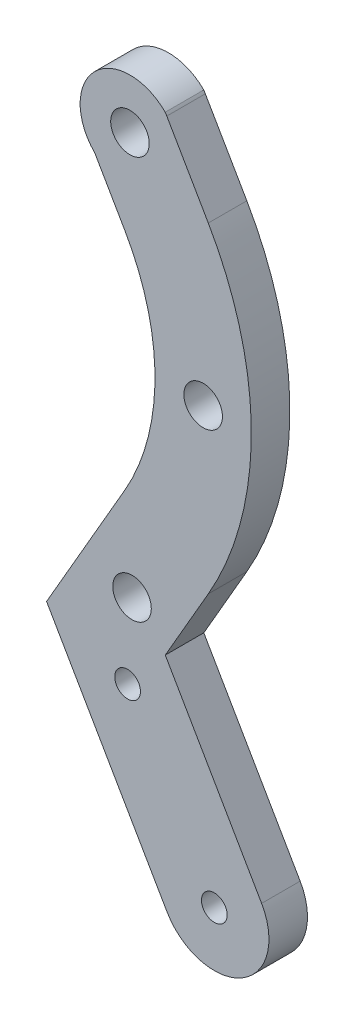
ISO-10303-21;
HEADER;
FILE_DESCRIPTION(('STEP AP214'),'2;1');
FILE_NAME('part.step','',(''),(''),'','','');
FILE_SCHEMA(('AUTOMOTIVE_DESIGN { 1 0 10303 214 1 1 1 1 }'));
ENDSEC;
DATA;
#1=APPLICATION_CONTEXT('core data for automotive mechanical design processes');
#2=APPLICATION_PROTOCOL_DEFINITION('international standard','automotive_design',2000,#1);
#3=PRODUCT_CONTEXT('',#1,'mechanical');
#4=PRODUCT('Part','Part','',(#3));
#5=PRODUCT_RELATED_PRODUCT_CATEGORY('part','',(#4));
#6=PRODUCT_DEFINITION_FORMATION('','',#4);
#7=PRODUCT_DEFINITION_CONTEXT('part definition',#1,'design');
#8=PRODUCT_DEFINITION('design','',#6,#7);
#9=PRODUCT_DEFINITION_SHAPE('','',#8);
#10=(LENGTH_UNIT() NAMED_UNIT(*) SI_UNIT(.MILLI.,.METRE.));
#11=(NAMED_UNIT(*) PLANE_ANGLE_UNIT() SI_UNIT($,.RADIAN.));
#12=(NAMED_UNIT(*) SI_UNIT($,.STERADIAN.) SOLID_ANGLE_UNIT());
#13=UNCERTAINTY_MEASURE_WITH_UNIT(LENGTH_MEASURE(1.E-05),#10,'distance_accuracy_value','');
#14=(GEOMETRIC_REPRESENTATION_CONTEXT(3) GLOBAL_UNCERTAINTY_ASSIGNED_CONTEXT((#13)) GLOBAL_UNIT_ASSIGNED_CONTEXT((#10,
#11,#12)) REPRESENTATION_CONTEXT('',''));
#15=CARTESIAN_POINT('',(0.,0.,0.));
#16=DIRECTION('',(0.,0.,1.));
#17=DIRECTION('',(1.,0.,0.));
#18=AXIS2_PLACEMENT_3D('',#15,#16,#17);
#19=CARTESIAN_POINT('',(29.893674629435,31.1070049645989,6.));
#20=DIRECTION('',(0.,0.,-1.));
#21=DIRECTION('',(-1.,0.,0.));
#22=AXIS2_PLACEMENT_3D('',#19,#20,#21);
#23=CYLINDRICAL_SURFACE('',#22,7.75728199138995);
#24=CARTESIAN_POINT('',(29.893674629435,31.1070049645989,0.));
#25=DIRECTION('',(0.,0.,1.));
#26=DIRECTION('',(1.,0.,0.));
#27=AXIS2_PLACEMENT_3D('',#24,#25,#26);
#28=CIRCLE('',#27,7.75728199138995);
#29=CARTESIAN_POINT('',(24.4084479297469,25.6217782649108,0.));
#30=VERTEX_POINT('',#29);
#31=CARTESIAN_POINT('',(35.3789013291231,36.592231664287,0.));
#32=VERTEX_POINT('',#31);
#33=EDGE_CURVE('E166',#30,#32,#28,.F.);
#34=ORIENTED_EDGE('',*,*,#33,.F.);
#35=DIRECTION('',(0.,0.,-1.));
#36=VECTOR('',#35,1.);
#37=CARTESIAN_POINT('',(24.4084479297469,25.6217782649108,6.));
#38=LINE('',#37,#36);
#39=CARTESIAN_POINT('',(24.4084479297469,25.6217782649108,6.));
#40=VERTEX_POINT('',#39);
#41=EDGE_CURVE('E11',#40,#30,#38,.T.);
#42=ORIENTED_EDGE('',*,*,#41,.F.);
#43=CARTESIAN_POINT('',(29.893674629435,31.1070049645989,6.));
#44=DIRECTION('',(0.,0.,1.));
#45=DIRECTION('',(1.,0.,0.));
#46=AXIS2_PLACEMENT_3D('',#43,#44,#45);
#47=CIRCLE('',#46,7.75728199138995);
#48=CARTESIAN_POINT('',(35.3789013291231,36.592231664287,6.));
#49=VERTEX_POINT('',#48);
#50=EDGE_CURVE('E415',#40,#49,#47,.F.);
#51=ORIENTED_EDGE('',*,*,#50,.T.);
#52=DIRECTION('',(0.,0.,-1.));
#53=VECTOR('',#52,1.);
#54=CARTESIAN_POINT('',(35.3789013291231,36.592231664287,6.));
#55=LINE('',#54,#53);
#56=EDGE_CURVE('E95',#49,#32,#55,.T.);
#57=ORIENTED_EDGE('',*,*,#56,.T.);
#58=EDGE_LOOP('',(#34,#42,#51,#57));
#59=FACE_BOUND('',#58,.T.);
#60=ADVANCED_FACE('F34',(#59),#23,.T.);
#61=CARTESIAN_POINT('',(29.4008913810825,16.974612553283,6.));
#62=DIRECTION('',(-0.866025403784437,-0.500000000000002,0.));
#63=DIRECTION('',(0.500000000000002,-0.866025403784438,0.));
#64=AXIS2_PLACEMENT_3D('',#61,#62,#63);
#65=PLANE('',#64);
#66=DIRECTION('',(-0.500000000000002,0.866025403784438,0.));
#67=VECTOR('',#66,1.);
#68=CARTESIAN_POINT('',(29.4008913810825,16.974612553283,0.));
#69=LINE('',#68,#67);
#70=CARTESIAN_POINT('',(29.0975587972916,17.5000000000001,0.));
#71=VERTEX_POINT('',#70);
#72=EDGE_CURVE('E168',#71,#30,#69,.T.);
#73=ORIENTED_EDGE('',*,*,#72,.F.);
#74=DIRECTION('',(0.,0.,-1.));
#75=VECTOR('',#74,1.);
#76=CARTESIAN_POINT('',(29.0975587972916,17.5000000000001,6.));
#77=LINE('',#76,#75);
#78=CARTESIAN_POINT('',(29.0975587972916,17.5000000000001,6.));
#79=VERTEX_POINT('',#78);
#80=EDGE_CURVE('E43',#79,#71,#77,.T.);
#81=ORIENTED_EDGE('',*,*,#80,.F.);
#82=DIRECTION('',(-0.500000000000002,0.866025403784438,0.));
#83=VECTOR('',#82,1.);
#84=CARTESIAN_POINT('',(29.4008913810825,16.974612553283,6.));
#85=LINE('',#84,#83);
#86=EDGE_CURVE('E225',#79,#40,#85,.T.);
#87=ORIENTED_EDGE('',*,*,#86,.T.);
#88=ORIENTED_EDGE('',*,*,#41,.T.);
#89=EDGE_LOOP('',(#73,#81,#87,#88));
#90=FACE_BOUND('',#89,.T.);
#91=ADVANCED_FACE('F224',(#90),#65,.T.);
#92=CARTESIAN_POINT('',(-1.21333033516375,0.,6.));
#93=DIRECTION('',(0.,0.,-1.));
#94=DIRECTION('',(-1.,0.,0.));
#95=AXIS2_PLACEMENT_3D('',#92,#93,#94);
#96=CYLINDRICAL_SURFACE('',#95,35.);
#97=CARTESIAN_POINT('',(-1.21333033516375,0.,0.));
#98=DIRECTION('',(0.,0.,1.));
#99=DIRECTION('',(1.,0.,0.));
#100=AXIS2_PLACEMENT_3D('',#97,#98,#99);
#101=CIRCLE('',#100,35.);
#102=CARTESIAN_POINT('',(29.0975587972916,-17.5,0.));
#103=VERTEX_POINT('',#102);
#104=EDGE_CURVE('E171',#71,#103,#101,.F.);
#105=ORIENTED_EDGE('',*,*,#104,.T.);
#106=DIRECTION('',(0.,0.,-1.));
#107=VECTOR('',#106,1.);
#108=CARTESIAN_POINT('',(29.0975587972916,-17.5,6.));
#109=LINE('',#108,#107);
#110=CARTESIAN_POINT('',(29.0975587972916,-17.5,6.));
#111=VERTEX_POINT('',#110);
#112=EDGE_CURVE('E209',#111,#103,#109,.T.);
#113=ORIENTED_EDGE('',*,*,#112,.F.);
#114=CARTESIAN_POINT('',(-1.21333033516375,0.,6.));
#115=DIRECTION('',(0.,0.,1.));
#116=DIRECTION('',(1.,0.,0.));
#117=AXIS2_PLACEMENT_3D('',#114,#115,#116);
#118=CIRCLE('',#117,35.);
#119=EDGE_CURVE('E217',#79,#111,#118,.F.);
#120=ORIENTED_EDGE('',*,*,#119,.F.);
#121=ORIENTED_EDGE('',*,*,#80,.T.);
#122=EDGE_LOOP('',(#105,#113,#120,#121));
#123=FACE_BOUND('',#122,.T.);
#124=ADVANCED_FACE('F214',(#123),#96,.F.);
#125=CARTESIAN_POINT('',(29.4008913810825,-16.974612553283,6.));
#126=DIRECTION('',(0.866025403784438,-0.500000000000001,0.));
#127=DIRECTION('',(0.500000000000001,0.866025403784438,0.));
#128=AXIS2_PLACEMENT_3D('',#125,#126,#127);
#129=PLANE('',#128);
#130=DIRECTION('',(-0.500000000000001,-0.866025403784438,0.));
#131=VECTOR('',#130,1.);
#132=CARTESIAN_POINT('',(29.4008913810825,-16.974612553283,0.));
#133=LINE('',#132,#131);
#134=CARTESIAN_POINT('',(16.9084479297469,-38.6121593216773,0.));
#135=VERTEX_POINT('',#134);
#136=EDGE_CURVE('E174',#103,#135,#133,.T.);
#137=ORIENTED_EDGE('',*,*,#136,.T.);
#138=DIRECTION('',(0.,0.,-1.));
#139=VECTOR('',#138,1.);
#140=CARTESIAN_POINT('',(16.9084479297469,-38.6121593216773,6.));
#141=LINE('',#140,#139);
#142=CARTESIAN_POINT('',(16.9084479297469,-38.6121593216773,6.));
#143=VERTEX_POINT('',#142);
#144=EDGE_CURVE('E206',#143,#135,#141,.T.);
#145=ORIENTED_EDGE('',*,*,#144,.F.);
#146=DIRECTION('',(-0.500000000000001,-0.866025403784438,0.));
#147=VECTOR('',#146,1.);
#148=CARTESIAN_POINT('',(29.4008913810825,-16.974612553283,6.));
#149=LINE('',#148,#147);
#150=EDGE_CURVE('E411',#111,#143,#149,.T.);
#151=ORIENTED_EDGE('',*,*,#150,.F.);
#152=ORIENTED_EDGE('',*,*,#112,.T.);
#153=EDGE_LOOP('',(#137,#145,#151,#152));
#154=FACE_BOUND('',#153,.T.);
#155=ADVANCED_FACE('F296',(#154),#129,.F.);
#156=CARTESIAN_POINT('',(-4.03821948646222,-2.33146710755577,6.));
#157=DIRECTION('',(0.866025403784438,0.500000000000001,0.));
#158=DIRECTION('',(-0.500000000000001,0.866025403784438,0.));
#159=AXIS2_PLACEMENT_3D('',#156,#157,#158);
#160=PLANE('',#159);
#161=DIRECTION('',(0.500000000000001,-0.866025403784438,0.));
#162=VECTOR('',#161,1.);
#163=CARTESIAN_POINT('',(-4.03821948646222,-2.33146710755577,0.));
#164=LINE('',#163,#162);
#165=CARTESIAN_POINT('',(35.658447929747,-71.0881119635938,0.));
#166=VERTEX_POINT('',#165);
#167=EDGE_CURVE('E177',#135,#166,#164,.T.);
#168=ORIENTED_EDGE('',*,*,#167,.T.);
#169=DIRECTION('',(0.,0.,-1.));
#170=VECTOR('',#169,1.);
#171=CARTESIAN_POINT('',(35.658447929747,-71.0881119635938,6.));
#172=LINE('',#171,#170);
#173=CARTESIAN_POINT('',(35.658447929747,-71.0881119635938,6.));
#174=VERTEX_POINT('',#173);
#175=EDGE_CURVE('E204',#174,#166,#172,.T.);
#176=ORIENTED_EDGE('',*,*,#175,.F.);
#177=DIRECTION('',(0.500000000000001,-0.866025403784438,0.));
#178=VECTOR('',#177,1.);
#179=CARTESIAN_POINT('',(-4.03821948646222,-2.33146710755577,6.));
#180=LINE('',#179,#178);
#181=EDGE_CURVE('E412',#143,#174,#180,.T.);
#182=ORIENTED_EDGE('',*,*,#181,.F.);
#183=ORIENTED_EDGE('',*,*,#144,.T.);
#184=EDGE_LOOP('',(#168,#176,#182,#183));
#185=FACE_BOUND('',#184,.T.);
#186=ADVANCED_FACE('F292',(#185),#160,.F.);
#187=CARTESIAN_POINT('',(43.0238289865135,-66.8357072277854,6.));
#188=DIRECTION('',(0.,0.,-1.));
#189=DIRECTION('',(-1.,0.,0.));
#190=AXIS2_PLACEMENT_3D('',#187,#188,#189);
#191=CYLINDRICAL_SURFACE('',#190,8.50480947161669);
#192=CARTESIAN_POINT('',(43.0238289865135,-66.8357072277854,0.));
#193=DIRECTION('',(0.,0.,1.));
#194=DIRECTION('',(1.,0.,0.));
#195=AXIS2_PLACEMENT_3D('',#192,#193,#194);
#196=CIRCLE('',#195,8.50480947161669);
#197=CARTESIAN_POINT('',(50.3892100432801,-62.5833024919771,0.));
#198=VERTEX_POINT('',#197);
#199=EDGE_CURVE('E180',#198,#166,#196,.F.);
#200=ORIENTED_EDGE('',*,*,#199,.F.);
#201=DIRECTION('',(0.,0.,-1.));
#202=VECTOR('',#201,1.);
#203=CARTESIAN_POINT('',(50.3892100432801,-62.5833024919771,6.));
#204=LINE('',#203,#202);
#205=CARTESIAN_POINT('',(50.3892100432801,-62.5833024919771,6.));
#206=VERTEX_POINT('',#205);
#207=EDGE_CURVE('E202',#206,#198,#204,.T.);
#208=ORIENTED_EDGE('',*,*,#207,.F.);
#209=CARTESIAN_POINT('',(43.0238289865135,-66.8357072277854,6.));
#210=DIRECTION('',(0.,0.,1.));
#211=DIRECTION('',(1.,0.,0.));
#212=AXIS2_PLACEMENT_3D('',#209,#210,#211);
#213=CIRCLE('',#212,8.50480947161669);
#214=EDGE_CURVE('E420',#206,#174,#213,.F.);
#215=ORIENTED_EDGE('',*,*,#214,.T.);
#216=ORIENTED_EDGE('',*,*,#175,.T.);
#217=EDGE_LOOP('',(#200,#208,#215,#216));
#218=FACE_BOUND('',#217,.T.);
#219=ADVANCED_FACE('F288',(#218),#191,.T.);
#220=CARTESIAN_POINT('',(10.6925426270709,6.17334236406095,6.));
#221=DIRECTION('',(0.866025403784438,0.500000000000001,0.));
#222=DIRECTION('',(-0.500000000000001,0.866025403784438,0.));
#223=AXIS2_PLACEMENT_3D('',#220,#221,#222);
#224=PLANE('',#223);
#225=DIRECTION('',(0.500000000000001,-0.866025403784438,0.));
#226=VECTOR('',#225,1.);
#227=CARTESIAN_POINT('',(10.6925426270709,6.17334236406095,0.));
#228=LINE('',#227,#226);
#229=CARTESIAN_POINT('',(35.38921004328,-36.6025403784439,0.));
#230=VERTEX_POINT('',#229);
#231=EDGE_CURVE('E183',#230,#198,#228,.T.);
#232=ORIENTED_EDGE('',*,*,#231,.F.);
#233=DIRECTION('',(0.,0.,-1.));
#234=VECTOR('',#233,1.);
#235=CARTESIAN_POINT('',(35.38921004328,-36.6025403784439,6.));
#236=LINE('',#235,#234);
#237=CARTESIAN_POINT('',(35.38921004328,-36.6025403784439,6.));
#238=VERTEX_POINT('',#237);
#239=EDGE_CURVE('E200',#238,#230,#236,.T.);
#240=ORIENTED_EDGE('',*,*,#239,.F.);
#241=DIRECTION('',(0.500000000000001,-0.866025403784438,0.));
#242=VECTOR('',#241,1.);
#243=CARTESIAN_POINT('',(10.6925426270709,6.17334236406095,6.));
#244=LINE('',#243,#242);
#245=EDGE_CURVE('E146',#238,#206,#244,.T.);
#246=ORIENTED_EDGE('',*,*,#245,.T.);
#247=ORIENTED_EDGE('',*,*,#207,.T.);
#248=EDGE_LOOP('',(#232,#240,#246,#247));
#249=FACE_BOUND('',#248,.T.);
#250=ADVANCED_FACE('F284',(#249),#224,.T.);
#251=CARTESIAN_POINT('',(42.3912724378491,-24.4746125532831,6.));
#252=DIRECTION('',(0.866025403784437,-0.500000000000002,0.));
#253=DIRECTION('',(0.500000000000003,0.866025403784437,0.));
#254=AXIS2_PLACEMENT_3D('',#251,#252,#253);
#255=PLANE('',#254);
#256=DIRECTION('',(-0.500000000000003,-0.866025403784437,0.));
#257=VECTOR('',#256,1.);
#258=CARTESIAN_POINT('',(42.3912724378491,-24.4746125532831,0.));
#259=LINE('',#258,#257);
#260=CARTESIAN_POINT('',(42.0879398540582,-25.,0.));
#261=VERTEX_POINT('',#260);
#262=EDGE_CURVE('E186',#261,#230,#259,.T.);
#263=ORIENTED_EDGE('',*,*,#262,.F.);
#264=DIRECTION('',(0.,0.,-1.));
#265=VECTOR('',#264,1.);
#266=CARTESIAN_POINT('',(42.0879398540582,-25.,6.));
#267=LINE('',#266,#265);
#268=CARTESIAN_POINT('',(42.0879398540582,-25.,6.));
#269=VERTEX_POINT('',#268);
#270=EDGE_CURVE('E132',#269,#261,#267,.T.);
#271=ORIENTED_EDGE('',*,*,#270,.F.);
#272=DIRECTION('',(-0.500000000000003,-0.866025403784437,0.));
#273=VECTOR('',#272,1.);
#274=CARTESIAN_POINT('',(42.3912724378491,-24.4746125532831,6.));
#275=LINE('',#274,#273);
#276=EDGE_CURVE('E144',#269,#238,#275,.T.);
#277=ORIENTED_EDGE('',*,*,#276,.T.);
#278=ORIENTED_EDGE('',*,*,#239,.T.);
#279=EDGE_LOOP('',(#263,#271,#277,#278));
#280=FACE_BOUND('',#279,.T.);
#281=ADVANCED_FACE('F281',(#280),#255,.T.);
#282=CARTESIAN_POINT('',(-1.21333033516375,0.,6.));
#283=DIRECTION('',(0.,0.,-1.));
#284=DIRECTION('',(-1.,0.,0.));
#285=AXIS2_PLACEMENT_3D('',#282,#283,#284);
#286=CYLINDRICAL_SURFACE('',#285,50.);
#287=CARTESIAN_POINT('',(-1.21333033516375,0.,0.));
#288=DIRECTION('',(0.,0.,1.));
#289=DIRECTION('',(1.,0.,0.));
#290=AXIS2_PLACEMENT_3D('',#287,#288,#289);
#291=CIRCLE('',#290,50.);
#292=CARTESIAN_POINT('',(42.0879398540581,25.0000000000001,0.));
#293=VERTEX_POINT('',#292);
#294=EDGE_CURVE('E129',#293,#261,#291,.F.);
#295=ORIENTED_EDGE('',*,*,#294,.F.);
#296=DIRECTION('',(0.,0.,-1.));
#297=VECTOR('',#296,1.);
#298=CARTESIAN_POINT('',(42.0879398540581,25.0000000000001,6.));
#299=LINE('',#298,#297);
#300=CARTESIAN_POINT('',(42.0879398540581,25.0000000000001,6.));
#301=VERTEX_POINT('',#300);
#302=EDGE_CURVE('E123',#301,#293,#299,.T.);
#303=ORIENTED_EDGE('',*,*,#302,.F.);
#304=CARTESIAN_POINT('',(-1.21333033516375,0.,6.));
#305=DIRECTION('',(0.,0.,1.));
#306=DIRECTION('',(1.,0.,0.));
#307=AXIS2_PLACEMENT_3D('',#304,#305,#306);
#308=CIRCLE('',#307,50.);
#309=EDGE_CURVE('E127',#301,#269,#308,.F.);
#310=ORIENTED_EDGE('',*,*,#309,.T.);
#311=ORIENTED_EDGE('',*,*,#270,.T.);
#312=EDGE_LOOP('',(#295,#303,#310,#311));
#313=FACE_BOUND('',#312,.T.);
#314=ADVANCED_FACE('F125',(#313),#286,.T.);
#315=CARTESIAN_POINT('',(42.3912724378491,24.474612553283,6.));
#316=DIRECTION('',(-0.866025403784438,-0.500000000000001,0.));
#317=DIRECTION('',(0.500000000000002,-0.866025403784438,0.));
#318=AXIS2_PLACEMENT_3D('',#315,#316,#317);
#319=PLANE('',#318);
#320=DIRECTION('',(-0.500000000000002,0.866025403784438,0.));
#321=VECTOR('',#320,1.);
#322=CARTESIAN_POINT('',(42.3912724378491,24.474612553283,0.));
#323=LINE('',#322,#321);
#324=CARTESIAN_POINT('',(35.6271150010397,36.1904769042317,0.));
#325=VERTEX_POINT('',#324);
#326=EDGE_CURVE('E190',#293,#325,#323,.T.);
#327=ORIENTED_EDGE('',*,*,#326,.T.);
#328=DIRECTION('',(0.,0.,-1.));
#329=VECTOR('',#328,1.);
#330=CARTESIAN_POINT('',(35.6271150010397,36.1904769042317,6.));
#331=LINE('',#330,#329);
#332=CARTESIAN_POINT('',(35.6271150010397,36.1904769042317,6.));
#333=VERTEX_POINT('',#332);
#334=EDGE_CURVE('E133',#333,#325,#331,.T.);
#335=ORIENTED_EDGE('',*,*,#334,.F.);
#336=DIRECTION('',(-0.500000000000002,0.866025403784438,0.));
#337=VECTOR('',#336,1.);
#338=CARTESIAN_POINT('',(42.3912724378491,24.474612553283,6.));
#339=LINE('',#338,#337);
#340=EDGE_CURVE('E136',#301,#333,#339,.T.);
#341=ORIENTED_EDGE('',*,*,#340,.F.);
#342=ORIENTED_EDGE('',*,*,#302,.T.);
#343=EDGE_LOOP('',(#327,#335,#341,#342));
#344=FACE_BOUND('',#343,.T.);
#345=ADVANCED_FACE('F137',(#344),#319,.F.);
#346=CARTESIAN_POINT('',(28.7694673862238,32.2312122078101,6.));
#347=DIRECTION('',(0.,0.,-1.));
#348=DIRECTION('',(-1.,0.,0.));
#349=AXIS2_PLACEMENT_3D('',#346,#347,#348);
#350=CYLINDRICAL_SURFACE('',#349,7.9185293928431);
#351=CARTESIAN_POINT('',(28.7694673862238,32.2312122078101,0.));
#352=DIRECTION('',(0.,0.,1.));
#353=DIRECTION('',(1.,0.,0.));
#354=AXIS2_PLACEMENT_3D('',#351,#352,#353);
#355=CIRCLE('',#354,7.9185293928431);
#356=EDGE_CURVE('E88',#325,#32,#355,.T.);
#357=ORIENTED_EDGE('',*,*,#356,.T.);
#358=ORIENTED_EDGE('',*,*,#56,.F.);
#359=CARTESIAN_POINT('',(28.7694673862238,32.2312122078101,6.));
#360=DIRECTION('',(0.,0.,1.));
#361=DIRECTION('',(1.,0.,0.));
#362=AXIS2_PLACEMENT_3D('',#359,#360,#361);
#363=CIRCLE('',#362,7.9185293928431);
#364=EDGE_CURVE('E51',#333,#49,#363,.T.);
#365=ORIENTED_EDGE('',*,*,#364,.F.);
#366=ORIENTED_EDGE('',*,*,#334,.T.);
#367=EDGE_LOOP('',(#357,#358,#365,#366));
#368=FACE_BOUND('',#367,.T.);
#369=ADVANCED_FACE('F238',(#368),#350,.T.);
#370=CARTESIAN_POINT('',(41.2866696648363,0.,6.));
#371=DIRECTION('',(0.,0.,-1.));
#372=DIRECTION('',(-1.,0.,0.));
#373=AXIS2_PLACEMENT_3D('',#370,#371,#372);
#374=CYLINDRICAL_SURFACE('',#373,3.);
#375=CARTESIAN_POINT('',(41.2866696648363,0.,6.));
#376=DIRECTION('',(0.,0.,1.));
#377=DIRECTION('',(1.,0.,0.));
#378=AXIS2_PLACEMENT_3D('',#375,#376,#377);
#379=CIRCLE('',#378,3.);
#380=CARTESIAN_POINT('',(44.2866696648363,0.,6.));
#381=VERTEX_POINT('',#380);
#382=EDGE_CURVE('E429',#381,#381,#379,.T.);
#383=ORIENTED_EDGE('',*,*,#382,.T.);
#384=EDGE_LOOP('',(#383));
#385=FACE_BOUND('',#384,.T.);
#386=CARTESIAN_POINT('',(41.2866696648363,0.,0.));
#387=DIRECTION('',(0.,0.,1.));
#388=DIRECTION('',(1.,0.,0.));
#389=AXIS2_PLACEMENT_3D('',#386,#387,#388);
#390=CIRCLE('',#389,3.);
#391=CARTESIAN_POINT('',(44.2866696648363,0.,0.));
#392=VERTEX_POINT('',#391);
#393=EDGE_CURVE('E163',#392,#392,#390,.T.);
#394=ORIENTED_EDGE('',*,*,#393,.F.);
#395=EDGE_LOOP('',(#394));
#396=FACE_BOUND('',#395,.T.);
#397=ADVANCED_FACE('F234',(#385,#396),#374,.F.);
#398=CARTESIAN_POINT('',(43.0238289865135,-66.8357072277854,6.));
#399=DIRECTION('',(0.,0.,-1.));
#400=DIRECTION('',(-1.,0.,0.));
#401=AXIS2_PLACEMENT_3D('',#398,#399,#400);
#402=CYLINDRICAL_SURFACE('',#401,2.);
#403=CARTESIAN_POINT('',(43.0238289865135,-66.8357072277854,6.));
#404=DIRECTION('',(0.,0.,1.));
#405=DIRECTION('',(1.,0.,0.));
#406=AXIS2_PLACEMENT_3D('',#403,#404,#405);
#407=CIRCLE('',#406,2.);
#408=CARTESIAN_POINT('',(45.0238289865135,-66.8357072277854,6.));
#409=VERTEX_POINT('',#408);
#410=EDGE_CURVE('E432',#409,#409,#407,.T.);
#411=ORIENTED_EDGE('',*,*,#410,.T.);
#412=EDGE_LOOP('',(#411));
#413=FACE_BOUND('',#412,.T.);
#414=CARTESIAN_POINT('',(43.0238289865135,-66.8357072277854,0.));
#415=DIRECTION('',(0.,0.,1.));
#416=DIRECTION('',(1.,0.,0.));
#417=AXIS2_PLACEMENT_3D('',#414,#415,#416);
#418=CIRCLE('',#417,2.);
#419=CARTESIAN_POINT('',(45.0238289865135,-66.8357072277854,0.));
#420=VERTEX_POINT('',#419);
#421=EDGE_CURVE('E160',#420,#420,#418,.T.);
#422=ORIENTED_EDGE('',*,*,#421,.F.);
#423=EDGE_LOOP('',(#422));
#424=FACE_BOUND('',#423,.T.);
#425=ADVANCED_FACE('F237',(#413,#424),#402,.F.);
#426=CARTESIAN_POINT('',(30.2120024790528,-31.4253328142167,6.));
#427=DIRECTION('',(0.,0.,-1.));
#428=DIRECTION('',(-1.,0.,0.));
#429=AXIS2_PLACEMENT_3D('',#426,#427,#428);
#430=CYLINDRICAL_SURFACE('',#429,3.);
#431=CARTESIAN_POINT('',(30.2120024790528,-31.4253328142167,6.));
#432=DIRECTION('',(0.,0.,1.));
#433=DIRECTION('',(1.,0.,0.));
#434=AXIS2_PLACEMENT_3D('',#431,#432,#433);
#435=CIRCLE('',#434,3.);
#436=CARTESIAN_POINT('',(33.2120024790528,-31.4253328142167,6.));
#437=VERTEX_POINT('',#436);
#438=EDGE_CURVE('E253',#437,#437,#435,.T.);
#439=ORIENTED_EDGE('',*,*,#438,.T.);
#440=EDGE_LOOP('',(#439));
#441=FACE_BOUND('',#440,.T.);
#442=CARTESIAN_POINT('',(30.2120024790528,-31.4253328142167,0.));
#443=DIRECTION('',(0.,0.,1.));
#444=DIRECTION('',(1.,0.,0.));
#445=AXIS2_PLACEMENT_3D('',#442,#443,#444);
#446=CIRCLE('',#445,3.);
#447=CARTESIAN_POINT('',(33.2120024790528,-31.4253328142167,0.));
#448=VERTEX_POINT('',#447);
#449=EDGE_CURVE('E157',#448,#448,#446,.T.);
#450=ORIENTED_EDGE('',*,*,#449,.F.);
#451=EDGE_LOOP('',(#450));
#452=FACE_BOUND('',#451,.T.);
#453=ADVANCED_FACE('F241',(#441,#452),#430,.F.);
#454=CARTESIAN_POINT('',(29.893674629435,31.1070049645989,6.));
#455=DIRECTION('',(0.,0.,-1.));
#456=DIRECTION('',(-1.,0.,0.));
#457=AXIS2_PLACEMENT_3D('',#454,#455,#456);
#458=CYLINDRICAL_SURFACE('',#457,3.);
#459=CARTESIAN_POINT('',(29.893674629435,31.1070049645989,6.));
#460=DIRECTION('',(0.,0.,1.));
#461=DIRECTION('',(1.,0.,0.));
#462=AXIS2_PLACEMENT_3D('',#459,#460,#461);
#463=CIRCLE('',#462,3.);
#464=CARTESIAN_POINT('',(32.893674629435,31.1070049645989,6.));
#465=VERTEX_POINT('',#464);
#466=EDGE_CURVE('E196',#465,#465,#463,.T.);
#467=ORIENTED_EDGE('',*,*,#466,.T.);
#468=EDGE_LOOP('',(#467));
#469=FACE_BOUND('',#468,.T.);
#470=CARTESIAN_POINT('',(29.893674629435,31.1070049645989,0.));
#471=DIRECTION('',(0.,0.,1.));
#472=DIRECTION('',(1.,0.,0.));
#473=AXIS2_PLACEMENT_3D('',#470,#471,#472);
#474=CIRCLE('',#473,3.);
#475=CARTESIAN_POINT('',(32.893674629435,31.1070049645989,0.));
#476=VERTEX_POINT('',#475);
#477=EDGE_CURVE('E154',#476,#476,#474,.T.);
#478=ORIENTED_EDGE('',*,*,#477,.F.);
#479=EDGE_LOOP('',(#478));
#480=FACE_BOUND('',#479,.T.);
#481=ADVANCED_FACE('F36',(#469,#480),#458,.F.);
#482=CARTESIAN_POINT('',(29.5238289865135,-43.4530213256056,6.));
#483=DIRECTION('',(0.,0.,-1.));
#484=DIRECTION('',(-1.,0.,0.));
#485=AXIS2_PLACEMENT_3D('',#482,#483,#484);
#486=CYLINDRICAL_SURFACE('',#485,2.);
#487=CARTESIAN_POINT('',(29.5238289865135,-43.4530213256056,6.));
#488=DIRECTION('',(0.,0.,1.));
#489=DIRECTION('',(1.,0.,0.));
#490=AXIS2_PLACEMENT_3D('',#487,#488,#489);
#491=CIRCLE('',#490,2.);
#492=CARTESIAN_POINT('',(31.5238289865135,-43.4530213256056,6.));
#493=VERTEX_POINT('',#492);
#494=EDGE_CURVE('E151',#493,#493,#491,.T.);
#495=ORIENTED_EDGE('',*,*,#494,.T.);
#496=EDGE_LOOP('',(#495));
#497=FACE_BOUND('',#496,.T.);
#498=CARTESIAN_POINT('',(29.5238289865135,-43.4530213256056,0.));
#499=DIRECTION('',(0.,0.,1.));
#500=DIRECTION('',(1.,0.,0.));
#501=AXIS2_PLACEMENT_3D('',#498,#499,#500);
#502=CIRCLE('',#501,2.);
#503=CARTESIAN_POINT('',(31.5238289865135,-43.4530213256056,0.));
#504=VERTEX_POINT('',#503);
#505=EDGE_CURVE('E193',#504,#504,#502,.T.);
#506=ORIENTED_EDGE('',*,*,#505,.F.);
#507=EDGE_LOOP('',(#506));
#508=FACE_BOUND('',#507,.T.);
#509=ADVANCED_FACE('F248',(#497,#508),#486,.F.);
#510=CARTESIAN_POINT('',(0.,0.,6.));
#511=DIRECTION('',(0.,0.,1.));
#512=DIRECTION('',(1.,0.,0.));
#513=AXIS2_PLACEMENT_3D('',#510,#511,#512);
#514=PLANE('',#513);
#515=ORIENTED_EDGE('',*,*,#466,.F.);
#516=EDGE_LOOP('',(#515));
#517=FACE_BOUND('',#516,.T.);
#518=ORIENTED_EDGE('',*,*,#438,.F.);
#519=EDGE_LOOP('',(#518));
#520=FACE_BOUND('',#519,.T.);
#521=ORIENTED_EDGE('',*,*,#410,.F.);
#522=EDGE_LOOP('',(#521));
#523=FACE_BOUND('',#522,.T.);
#524=ORIENTED_EDGE('',*,*,#382,.F.);
#525=EDGE_LOOP('',(#524));
#526=FACE_BOUND('',#525,.T.);
#527=ORIENTED_EDGE('',*,*,#50,.F.);
#528=ORIENTED_EDGE('',*,*,#86,.F.);
#529=ORIENTED_EDGE('',*,*,#119,.T.);
#530=ORIENTED_EDGE('',*,*,#150,.T.);
#531=ORIENTED_EDGE('',*,*,#181,.T.);
#532=ORIENTED_EDGE('',*,*,#214,.F.);
#533=ORIENTED_EDGE('',*,*,#245,.F.);
#534=ORIENTED_EDGE('',*,*,#276,.F.);
#535=ORIENTED_EDGE('',*,*,#309,.F.);
#536=ORIENTED_EDGE('',*,*,#340,.T.);
#537=ORIENTED_EDGE('',*,*,#364,.T.);
#538=EDGE_LOOP('',(#527,#528,#529,#530,#531,#532,#533,#534,#535,#536,#537));
#539=FACE_BOUND('',#538,.T.);
#540=ORIENTED_EDGE('',*,*,#494,.F.);
#541=EDGE_LOOP('',(#540));
#542=FACE_BOUND('',#541,.T.);
#543=ADVANCED_FACE('F140',(#517,#520,#523,#526,#539,#542),#514,.T.);
#544=CARTESIAN_POINT('',(0.,0.,0.));
#545=DIRECTION('',(0.,0.,1.));
#546=DIRECTION('',(1.,0.,0.));
#547=AXIS2_PLACEMENT_3D('',#544,#545,#546);
#548=PLANE('',#547);
#549=ORIENTED_EDGE('',*,*,#477,.T.);
#550=EDGE_LOOP('',(#549));
#551=FACE_BOUND('',#550,.T.);
#552=ORIENTED_EDGE('',*,*,#449,.T.);
#553=EDGE_LOOP('',(#552));
#554=FACE_BOUND('',#553,.T.);
#555=ORIENTED_EDGE('',*,*,#421,.T.);
#556=EDGE_LOOP('',(#555));
#557=FACE_BOUND('',#556,.T.);
#558=ORIENTED_EDGE('',*,*,#393,.T.);
#559=EDGE_LOOP('',(#558));
#560=FACE_BOUND('',#559,.T.);
#561=ORIENTED_EDGE('',*,*,#33,.T.);
#562=ORIENTED_EDGE('',*,*,#356,.F.);
#563=ORIENTED_EDGE('',*,*,#326,.F.);
#564=ORIENTED_EDGE('',*,*,#294,.T.);
#565=ORIENTED_EDGE('',*,*,#262,.T.);
#566=ORIENTED_EDGE('',*,*,#231,.T.);
#567=ORIENTED_EDGE('',*,*,#199,.T.);
#568=ORIENTED_EDGE('',*,*,#167,.F.);
#569=ORIENTED_EDGE('',*,*,#136,.F.);
#570=ORIENTED_EDGE('',*,*,#104,.F.);
#571=ORIENTED_EDGE('',*,*,#72,.T.);
#572=EDGE_LOOP('',(#561,#562,#563,#564,#565,#566,#567,#568,#569,#570,#571));
#573=FACE_BOUND('',#572,.T.);
#574=ORIENTED_EDGE('',*,*,#505,.T.);
#575=EDGE_LOOP('',(#574));
#576=FACE_BOUND('',#575,.T.);
#577=ADVANCED_FACE('F222',(#551,#554,#557,#560,#573,#576),#548,.F.);
#578=CLOSED_SHELL('',(#60,#91,#124,#155,#186,#219,#250,#281,#314,#345,#369,#397,#425,#453,#481,
#509,#543,#577));
#579=MANIFOLD_SOLID_BREP('B2',#578);
#580=ADVANCED_BREP_SHAPE_REPRESENTATION('',(#18,#579),#14);
#581=SHAPE_DEFINITION_REPRESENTATION(#9,#580);
ENDSEC;
END-ISO-10303-21;
